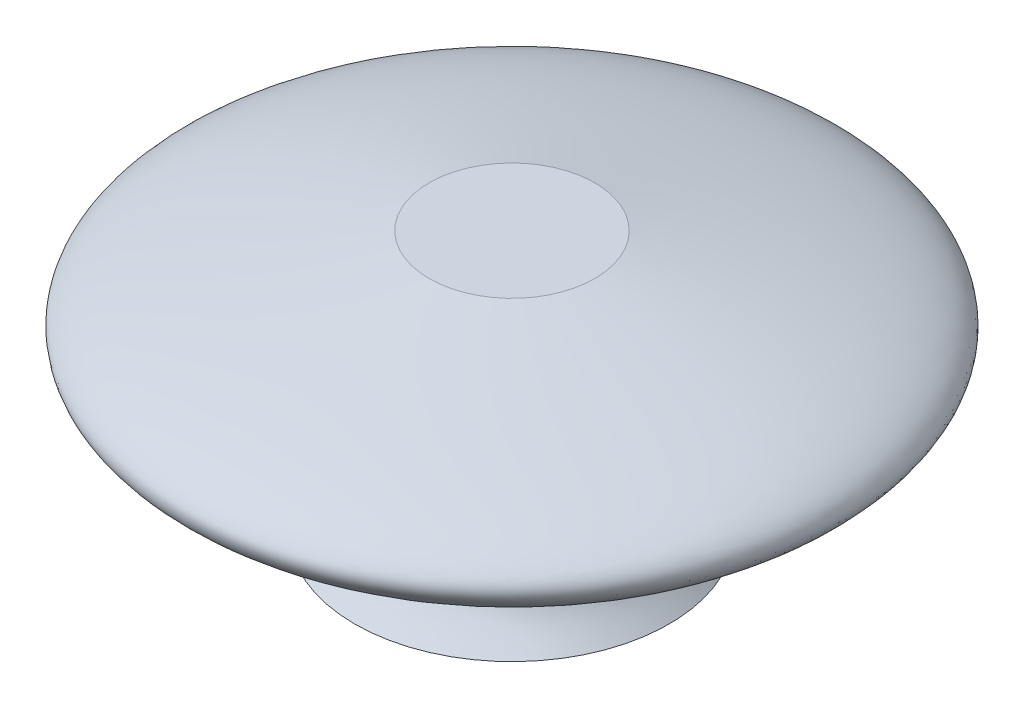
ISO-10303-21;
HEADER;
FILE_DESCRIPTION(('STEP AP214'),'2;1');
FILE_NAME('part.step','',(''),(''),'','','');
FILE_SCHEMA(('AUTOMOTIVE_DESIGN { 1 0 10303 214 1 1 1 1 }'));
ENDSEC;
DATA;
#1=APPLICATION_CONTEXT('core data for automotive mechanical design processes');
#2=APPLICATION_PROTOCOL_DEFINITION('international standard','automotive_design',2000,#1);
#3=PRODUCT_CONTEXT('',#1,'mechanical');
#4=PRODUCT('Part','Part','',(#3));
#5=PRODUCT_RELATED_PRODUCT_CATEGORY('part','',(#4));
#6=PRODUCT_DEFINITION_FORMATION('','',#4);
#7=PRODUCT_DEFINITION_CONTEXT('part definition',#1,'design');
#8=PRODUCT_DEFINITION('design','',#6,#7);
#9=PRODUCT_DEFINITION_SHAPE('','',#8);
#10=(LENGTH_UNIT() NAMED_UNIT(*) SI_UNIT(.MILLI.,.METRE.));
#11=(NAMED_UNIT(*) PLANE_ANGLE_UNIT() SI_UNIT($,.RADIAN.));
#12=(NAMED_UNIT(*) SI_UNIT($,.STERADIAN.) SOLID_ANGLE_UNIT());
#13=UNCERTAINTY_MEASURE_WITH_UNIT(LENGTH_MEASURE(1.E-05),#10,'distance_accuracy_value','');
#14=(GEOMETRIC_REPRESENTATION_CONTEXT(3) GLOBAL_UNCERTAINTY_ASSIGNED_CONTEXT((#13)) GLOBAL_UNIT_ASSIGNED_CONTEXT((#10,
#11,#12)) REPRESENTATION_CONTEXT('',''));
#15=CARTESIAN_POINT('',(0.,0.,0.));
#16=DIRECTION('',(0.,0.,1.));
#17=DIRECTION('',(1.,0.,0.));
#18=AXIS2_PLACEMENT_3D('',#15,#16,#17);
#19=CARTESIAN_POINT('',(0.,-7.3962583253521E-11,76.2));
#20=DIRECTION('',(0.,-1.,0.));
#21=DIRECTION('',(0.,0.,-1.));
#22=AXIS2_PLACEMENT_3D('',#19,#20,#21);
#23=PLANE('',#22);
#24=CARTESIAN_POINT('',(0.,-7.39963645912667E-11,0.));
#25=DIRECTION('',(0.,1.,0.));
#26=DIRECTION('',(0.,0.,1.));
#27=AXIS2_PLACEMENT_3D('',#24,#25,#26);
#28=CIRCLE('',#27,67.2870859185201);
#29=CARTESIAN_POINT('',(0.,-7.40042804617834E-11,67.2870859185201));
#30=VERTEX_POINT('',#29);
#31=EDGE_CURVE('E57',#30,#30,#28,.T.);
#32=ORIENTED_EDGE('',*,*,#31,.T.);
#33=EDGE_LOOP('',(#32));
#34=FACE_BOUND('',#33,.T.);
#35=CARTESIAN_POINT('',(0.,-1.47909462455686E-10,0.));
#36=DIRECTION('',(0.,1.,0.));
#37=DIRECTION('',(0.,0.,1.));
#38=AXIS2_PLACEMENT_3D('',#35,#36,#37);
#39=CIRCLE('',#38,76.2000000001479);
#40=CARTESIAN_POINT('',(0.,-1.47918426870256E-10,76.2000000001479));
#41=VERTEX_POINT('',#40);
#42=EDGE_CURVE('E10',#41,#41,#39,.T.);
#43=ORIENTED_EDGE('',*,*,#42,.F.);
#44=EDGE_LOOP('',(#43));
#45=FACE_BOUND('',#44,.T.);
#46=ADVANCED_FACE('F45',(#34,#45),#23,.T.);
#47=CARTESIAN_POINT('',(0.,127.000000000096,40.1749024408132));
#48=CARTESIAN_POINT('',(0.,126.750604813647,41.4414019159804));
#49=CARTESIAN_POINT('',(0.,126.236821262657,44.0461469493341));
#50=CARTESIAN_POINT('',(0.,124.940007316639,50.6007651131398));
#51=CARTESIAN_POINT('',(0.,123.208199153791,59.2534667309492));
#52=CARTESIAN_POINT('',(0.,121.107831932759,69.5492039135018));
#53=CARTESIAN_POINT('',(0.,118.631164572305,81.2804931451384));
#54=CARTESIAN_POINT('',(0.,116.043722317481,92.9743398017113));
#55=CARTESIAN_POINT('',(0.,113.638494881453,103.187830033595));
#56=CARTESIAN_POINT('',(0.,111.438757457169,111.899086191148));
#57=CARTESIAN_POINT('',(0.,109.47856640541,119.130970304749));
#58=CARTESIAN_POINT('',(0.,107.8176076684,124.887113283262));
#59=CARTESIAN_POINT('',(0.,106.120426966313,130.348260356577));
#60=CARTESIAN_POINT('',(0.,104.375363987972,135.503413051751));
#61=CARTESIAN_POINT('',(0.,102.567404063101,140.345698028262));
#62=CARTESIAN_POINT('',(0.,100.67941193831,144.86096102996));
#63=CARTESIAN_POINT('',(0.,98.6725808444847,149.013238587429));
#64=CARTESIAN_POINT('',(0.,96.7316735212819,152.350499486438));
#65=CARTESIAN_POINT('',(0.,94.9195395244382,154.873873337877));
#66=CARTESIAN_POINT('',(0.,93.0877146803733,156.924745485323));
#67=CARTESIAN_POINT('',(0.,91.48276353761,158.295776635676));
#68=CARTESIAN_POINT('',(0.,89.7732636818288,159.252299622537));
#69=CARTESIAN_POINT('',(0.,87.8592681581827,159.736253807185));
#70=CARTESIAN_POINT('',(0.,86.0844807038876,159.786660465806));
#71=CARTESIAN_POINT('',(0.,84.1001993952569,159.235545276165));
#72=CARTESIAN_POINT('',(0.,82.1097331427682,158.07085483509));
#73=CARTESIAN_POINT('',(0.,80.2218440911229,156.490016664036));
#74=CARTESIAN_POINT('',(0.,78.5261683683309,154.695602780494));
#75=CARTESIAN_POINT('',(0.,76.5037296615984,152.164404507099));
#76=CARTESIAN_POINT('',(0.,74.6389666124791,149.385593584959));
#77=CARTESIAN_POINT('',(0.,72.9185517380925,146.516665851494));
#78=CARTESIAN_POINT('',(0.,71.3055334179342,143.584038251892));
#79=CARTESIAN_POINT('',(0.,70.0653863918413,141.208226674822));
#80=CARTESIAN_POINT('',(0.,68.5689572034451,138.210817825149));
#81=CARTESIAN_POINT('',(0.,66.8433159192722,134.579838964754));
#82=CARTESIAN_POINT('',(0.,64.9062203865829,130.308342207473));
#83=CARTESIAN_POINT('',(0.,62.762562613053,125.395635429144));
#84=CARTESIAN_POINT('',(0.,60.6631460231846,120.463919061085));
#85=CARTESIAN_POINT('',(0.,58.5865110371218,115.522613746369));
#86=CARTESIAN_POINT('',(0.,56.5137495910616,110.579691347375));
#87=CARTESIAN_POINT('',(0.,54.4267763565332,105.64271800374));
#88=CARTESIAN_POINT('',(0.,52.3071530845373,100.719657491014));
#89=CARTESIAN_POINT('',(0.,50.1345768528473,95.8195855351887));
#90=CARTESIAN_POINT('',(0.,47.9486064911945,91.0907223648294));
#91=CARTESIAN_POINT('',(0.,45.729445384778,86.5438567296949));
#92=CARTESIAN_POINT('',(0.,43.455787146311,82.1931014951121));
#93=CARTESIAN_POINT('',(0.,41.1032395472427,78.0556726941767));
#94=CARTESIAN_POINT('',(0.,38.5916748036769,74.0989263438811));
#95=CARTESIAN_POINT('',(0.,35.8605911609333,70.3770107658067));
#96=CARTESIAN_POINT('',(0.,33.1569889764353,67.3578049489096));
#97=CARTESIAN_POINT('',(0.,30.522582099662,65.065519537557));
#98=CARTESIAN_POINT('',(0.,27.7355173108077,63.3008061194239));
#99=CARTESIAN_POINT('',(0.,25.1919312826546,62.2683351851954));
#100=CARTESIAN_POINT('',(0.,22.5472037983406,61.8420741766122));
#101=CARTESIAN_POINT('',(0.,19.7008978781058,62.0320574386416));
#102=CARTESIAN_POINT('',(0.,17.0529703642573,62.7338520762031));
#103=CARTESIAN_POINT('',(0.,14.0879609814861,64.1002931278472));
#104=CARTESIAN_POINT('',(0.,11.3675849542353,65.8760802994529));
#105=CARTESIAN_POINT('',(0.,9.23724869482313,67.5348624456559));
#106=CARTESIAN_POINT('',(0.,7.5953456734944,68.9335408016827));
#107=CARTESIAN_POINT('',(0.,6.58761499355251,69.8287383499107));
#108=CARTESIAN_POINT('',(0.,5.79172106959034,70.5546454425472));
#109=CARTESIAN_POINT('',(0.,4.99678811068907,71.2969783884874));
#110=CARTESIAN_POINT('',(0.,4.24342724590696,72.0122796605542));
#111=CARTESIAN_POINT('',(0.,3.18812102852854,73.0350535422401));
#112=CARTESIAN_POINT('',(0.,2.24660085821184,73.9568237836201));
#113=CARTESIAN_POINT('',(0.,0.987154508055459,75.2128453361537));
#114=CARTESIAN_POINT('',(0.,0.328503393954512,75.8714966060274));
#115=CARTESIAN_POINT('',(0.,-1.47916202092472E-10,76.2000000001479));
#116=B_SPLINE_CURVE_WITH_KNOTS('',4,(#47,#48,#49,#50,#51,#52,#53,#54,#55,#56,#57,#58,#59,#60,
#61,#62,#63,#64,#65,#66,#67,#68,#69,#70,#71,#72,#73,#74,#75,#76,#77,#78,#79,#80,#81,#82,#83,#84,
#85,#86,#87,#88,#89,#90,#91,#92,#93,#94,#95,#96,#97,#98,#99,#100,#101,#102,#103,#104,#105,#106,
#107,#108,#109,#110,#111,#112,#113,#114,#115),.UNSPECIFIED.,.F.,.F.,(5,1,1,1,1,1,1,1,1,1,1,1,1,
1,1,1,1,1,1,1,1,1,1,1,1,1,1,1,1,1,1,1,1,1,1,1,1,1,1,1,1,1,1,1,1,1,1,1,1,1,1,1,1,1,1,1,1,1,1,1,1,
1,1,1,1,5),(0.0525184971901413,0.0711068415006343,0.0896951858111271,0.126871874432113,
0.164048560363417,0.201225246294721,0.238401828536417,0.275578410778112,0.294166807268909,
0.312755203759705,0.331343600250502,0.349931996741299,0.365109530948087,0.380287065154876,
0.395464599361665,0.410642133568453,0.422295658327609,0.428122420707187,0.433949183086765,
0.444703884246296,0.448388470393544,0.452073056540792,0.458322057272131,0.466492156470652,
0.473494477511983,0.480496798553313,0.488788028985121,0.497079259416929,0.513661720280545,
0.521975298710147,0.530288877139749,0.538602455569351,0.546916033998954,0.563543190858158,
0.580170347717363,0.596797482264006,0.613424616810648,0.630051751357291,0.646678885903933,
0.663306008802505,0.679933131701077,0.696560254599649,0.71318737749822,0.727947044897966,
0.742706712297712,0.757466379697457,0.772226047097203,0.786074143834076,0.79992224057095,
0.807657563012976,0.815392885455002,0.826889426358368,0.833712833618788,0.840536240879207,
0.85060448637308,0.860672731866954,0.874052837344067,0.880742890082623,0.884087916451901,
0.887432942821179,0.890777969190457,0.894122995559735,0.897468021929014,0.900813048298292,
0.907503101036848,0.914193153775404),.UNSPECIFIED.);
#117=CARTESIAN_POINT('',(0.,127.,0.));
#118=DIRECTION('',(0.,1.,0.));
#119=AXIS1_PLACEMENT('',#117,#118);
#120=SURFACE_OF_REVOLUTION('',#116,#119);
#121=ORIENTED_EDGE('',*,*,#42,.T.);
#122=EDGE_LOOP('',(#121));
#123=FACE_BOUND('',#122,.T.);
#124=CARTESIAN_POINT('',(0.,127.,0.));
#125=DIRECTION('',(0.,1.,0.));
#126=DIRECTION('',(0.,0.,1.));
#127=AXIS2_PLACEMENT_3D('',#124,#125,#126);
#128=CIRCLE('',#127,40.1749024412989);
#129=CARTESIAN_POINT('',(0.,127.,40.1749024412989));
#130=VERTEX_POINT('',#129);
#131=EDGE_CURVE('E52',#130,#130,#128,.T.);
#132=ORIENTED_EDGE('',*,*,#131,.F.);
#133=EDGE_LOOP('',(#132));
#134=FACE_BOUND('',#133,.T.);
#135=ADVANCED_FACE('F73',(#123,#134),#120,.F.);
#136=CARTESIAN_POINT('',(0.,127.,40.1749024412989));
#137=DIRECTION('',(0.,1.,0.));
#138=DIRECTION('',(0.,0.,1.));
#139=AXIS2_PLACEMENT_3D('',#136,#137,#138);
#140=PLANE('',#139);
#141=ORIENTED_EDGE('',*,*,#131,.T.);
#142=EDGE_LOOP('',(#141));
#143=FACE_BOUND('',#142,.T.);
#144=ADVANCED_FACE('F78',(#143),#140,.T.);
#145=CARTESIAN_POINT('',(0.,127.000000000096,40.1749024408132));
#146=CARTESIAN_POINT('',(0.,126.750604813647,41.4414019159804));
#147=CARTESIAN_POINT('',(0.,126.236821262657,44.0461469493341));
#148=CARTESIAN_POINT('',(0.,124.940007316639,50.6007651131398));
#149=CARTESIAN_POINT('',(0.,123.208199153791,59.2534667309492));
#150=CARTESIAN_POINT('',(0.,121.107831932759,69.5492039135018));
#151=CARTESIAN_POINT('',(0.,118.631164572305,81.2804931451384));
#152=CARTESIAN_POINT('',(0.,116.043722317481,92.9743398017113));
#153=CARTESIAN_POINT('',(0.,113.638494881453,103.187830033595));
#154=CARTESIAN_POINT('',(0.,111.438757457169,111.899086191148));
#155=CARTESIAN_POINT('',(0.,109.47856640541,119.130970304749));
#156=CARTESIAN_POINT('',(0.,107.8176076684,124.887113283262));
#157=CARTESIAN_POINT('',(0.,106.120426966313,130.348260356577));
#158=CARTESIAN_POINT('',(0.,104.375363987972,135.503413051751));
#159=CARTESIAN_POINT('',(0.,102.567404063101,140.345698028262));
#160=CARTESIAN_POINT('',(0.,100.67941193831,144.86096102996));
#161=CARTESIAN_POINT('',(0.,98.6725808444847,149.013238587429));
#162=CARTESIAN_POINT('',(0.,96.7316735212819,152.350499486438));
#163=CARTESIAN_POINT('',(0.,94.9195395244382,154.873873337877));
#164=CARTESIAN_POINT('',(0.,93.0877146803733,156.924745485323));
#165=CARTESIAN_POINT('',(0.,91.48276353761,158.295776635676));
#166=CARTESIAN_POINT('',(0.,89.7732636818288,159.252299622537));
#167=CARTESIAN_POINT('',(0.,87.8592681581827,159.736253807185));
#168=CARTESIAN_POINT('',(0.,86.0844807038876,159.786660465806));
#169=CARTESIAN_POINT('',(0.,84.1001993952569,159.235545276165));
#170=CARTESIAN_POINT('',(0.,82.1097331427682,158.07085483509));
#171=CARTESIAN_POINT('',(0.,80.2218440911229,156.490016664036));
#172=CARTESIAN_POINT('',(0.,78.5261683683309,154.695602780494));
#173=CARTESIAN_POINT('',(0.,76.5037296615984,152.164404507099));
#174=CARTESIAN_POINT('',(0.,74.6389666124791,149.385593584959));
#175=CARTESIAN_POINT('',(0.,72.9185517380925,146.516665851494));
#176=CARTESIAN_POINT('',(0.,71.3055334179342,143.584038251892));
#177=CARTESIAN_POINT('',(0.,70.0653863918413,141.208226674822));
#178=CARTESIAN_POINT('',(0.,68.5689572034451,138.210817825149));
#179=CARTESIAN_POINT('',(0.,66.8433159192722,134.579838964754));
#180=CARTESIAN_POINT('',(0.,64.9062203865829,130.308342207473));
#181=CARTESIAN_POINT('',(0.,62.762562613053,125.395635429144));
#182=CARTESIAN_POINT('',(0.,60.6631460231846,120.463919061085));
#183=CARTESIAN_POINT('',(0.,58.5865110371218,115.522613746369));
#184=CARTESIAN_POINT('',(0.,56.5137495910616,110.579691347375));
#185=CARTESIAN_POINT('',(0.,54.4267763565332,105.64271800374));
#186=CARTESIAN_POINT('',(0.,52.3071530845373,100.719657491014));
#187=CARTESIAN_POINT('',(0.,50.1345768528473,95.8195855351887));
#188=CARTESIAN_POINT('',(0.,47.9486064911945,91.0907223648294));
#189=CARTESIAN_POINT('',(0.,45.729445384778,86.5438567296949));
#190=CARTESIAN_POINT('',(0.,43.455787146311,82.1931014951121));
#191=CARTESIAN_POINT('',(0.,41.1032395472427,78.0556726941767));
#192=CARTESIAN_POINT('',(0.,38.5916748036769,74.0989263438811));
#193=CARTESIAN_POINT('',(0.,35.8605911609333,70.3770107658067));
#194=CARTESIAN_POINT('',(0.,33.1569889764353,67.3578049489096));
#195=CARTESIAN_POINT('',(0.,30.522582099662,65.065519537557));
#196=CARTESIAN_POINT('',(0.,27.7355173108077,63.3008061194239));
#197=CARTESIAN_POINT('',(0.,25.1919312826546,62.2683351851954));
#198=CARTESIAN_POINT('',(0.,22.5472037983406,61.8420741766122));
#199=CARTESIAN_POINT('',(0.,19.7008978781058,62.0320574386416));
#200=CARTESIAN_POINT('',(0.,17.0529703642573,62.7338520762031));
#201=CARTESIAN_POINT('',(0.,14.0879609814861,64.1002931278472));
#202=CARTESIAN_POINT('',(0.,11.3675849542353,65.8760802994529));
#203=CARTESIAN_POINT('',(0.,9.23724869482313,67.5348624456559));
#204=CARTESIAN_POINT('',(0.,7.5953456734944,68.9335408016827));
#205=CARTESIAN_POINT('',(0.,6.58761499355251,69.8287383499107));
#206=CARTESIAN_POINT('',(0.,5.79172106959034,70.5546454425472));
#207=CARTESIAN_POINT('',(0.,4.99678811068907,71.2969783884874));
#208=CARTESIAN_POINT('',(0.,4.24342724590696,72.0122796605542));
#209=CARTESIAN_POINT('',(0.,3.18812102852854,73.0350535422401));
#210=CARTESIAN_POINT('',(0.,2.24660085821184,73.9568237836201));
#211=CARTESIAN_POINT('',(0.,0.987154508055459,75.2128453361537));
#212=CARTESIAN_POINT('',(0.,0.328503393954512,75.8714966060274));
#213=CARTESIAN_POINT('',(0.,-1.47916202092472E-10,76.2000000001479));
#214=B_SPLINE_CURVE_WITH_KNOTS('',4,(#145,#146,#147,#148,#149,#150,#151,#152,#153,#154,#155,
#156,#157,#158,#159,#160,#161,#162,#163,#164,#165,#166,#167,#168,#169,#170,#171,#172,#173,#174,
#175,#176,#177,#178,#179,#180,#181,#182,#183,#184,#185,#186,#187,#188,#189,#190,#191,#192,#193,
#194,#195,#196,#197,#198,#199,#200,#201,#202,#203,#204,#205,#206,#207,#208,#209,#210,#211,#212,
#213),.UNSPECIFIED.,.F.,.F.,(5,1,1,1,1,1,1,1,1,1,1,1,1,1,1,1,1,1,1,1,1,1,1,1,1,1,1,1,1,1,1,1,1,
1,1,1,1,1,1,1,1,1,1,1,1,1,1,1,1,1,1,1,1,1,1,1,1,1,1,1,1,1,1,1,1,5),(0.0525184971901413,
0.0711068415006343,0.0896951858111271,0.126871874432113,0.164048560363417,0.201225246294721,
0.238401828536417,0.275578410778112,0.294166807268909,0.312755203759705,0.331343600250502,
0.349931996741299,0.365109530948087,0.380287065154876,0.395464599361665,0.410642133568453,
0.422295658327609,0.428122420707187,0.433949183086765,0.444703884246296,0.448388470393544,
0.452073056540792,0.458322057272131,0.466492156470652,0.473494477511983,0.480496798553313,
0.488788028985121,0.497079259416929,0.513661720280545,0.521975298710147,0.530288877139749,
0.538602455569351,0.546916033998954,0.563543190858158,0.580170347717363,0.596797482264006,
0.613424616810648,0.630051751357291,0.646678885903933,0.663306008802505,0.679933131701077,
0.696560254599649,0.71318737749822,0.727947044897966,0.742706712297712,0.757466379697457,
0.772226047097203,0.786074143834076,0.79992224057095,0.807657563012976,0.815392885455002,
0.826889426358368,0.833712833618788,0.840536240879207,0.85060448637308,0.860672731866954,
0.874052837344067,0.880742890082623,0.884087916451901,0.887432942821179,0.890777969190457,
0.894122995559735,0.897468021929014,0.900813048298292,0.907503101036848,0.914193153775404),.UNSPECIFIED.);
#215=CARTESIAN_POINT('',(0.,127.,0.));
#216=DIRECTION('',(0.,1.,0.));
#217=AXIS1_PLACEMENT('',#215,#216);
#218=SURFACE_OF_REVOLUTION('',#214,#217);
#219=OFFSET_SURFACE('',#218,6.35,.F.);
#220=ORIENTED_EDGE('',*,*,#31,.F.);
#221=EDGE_LOOP('',(#220));
#222=FACE_BOUND('',#221,.T.);
#223=CARTESIAN_POINT('',(0.,120.65,0.));
#224=DIRECTION('',(0.,1.,0.));
#225=DIRECTION('',(0.,0.,1.));
#226=AXIS2_PLACEMENT_3D('',#223,#224,#225);
#227=CIRCLE('',#226,39.5554461084883);
#228=CARTESIAN_POINT('',(0.,120.65,39.5554461084883));
#229=VERTEX_POINT('',#228);
#230=EDGE_CURVE('E62',#229,#229,#227,.T.);
#231=ORIENTED_EDGE('',*,*,#230,.T.);
#232=EDGE_LOOP('',(#231));
#233=FACE_BOUND('',#232,.T.);
#234=ADVANCED_FACE('F79',(#222,#233),#219,.T.);
#235=CARTESIAN_POINT('',(0.,120.65,40.1749024412989));
#236=DIRECTION('',(0.,1.,0.));
#237=DIRECTION('',(0.,0.,1.));
#238=AXIS2_PLACEMENT_3D('',#235,#236,#237);
#239=PLANE('',#238);
#240=ORIENTED_EDGE('',*,*,#230,.F.);
#241=EDGE_LOOP('',(#240));
#242=FACE_BOUND('',#241,.T.);
#243=ADVANCED_FACE('F80',(#242),#239,.F.);
#244=CLOSED_SHELL('',(#46,#135,#144,#234,#243));
#245=MANIFOLD_SOLID_BREP('B2',#244);
#246=ADVANCED_BREP_SHAPE_REPRESENTATION('',(#18,#245),#14);
#247=SHAPE_DEFINITION_REPRESENTATION(#9,#246);
ENDSEC;
END-ISO-10303-21;
